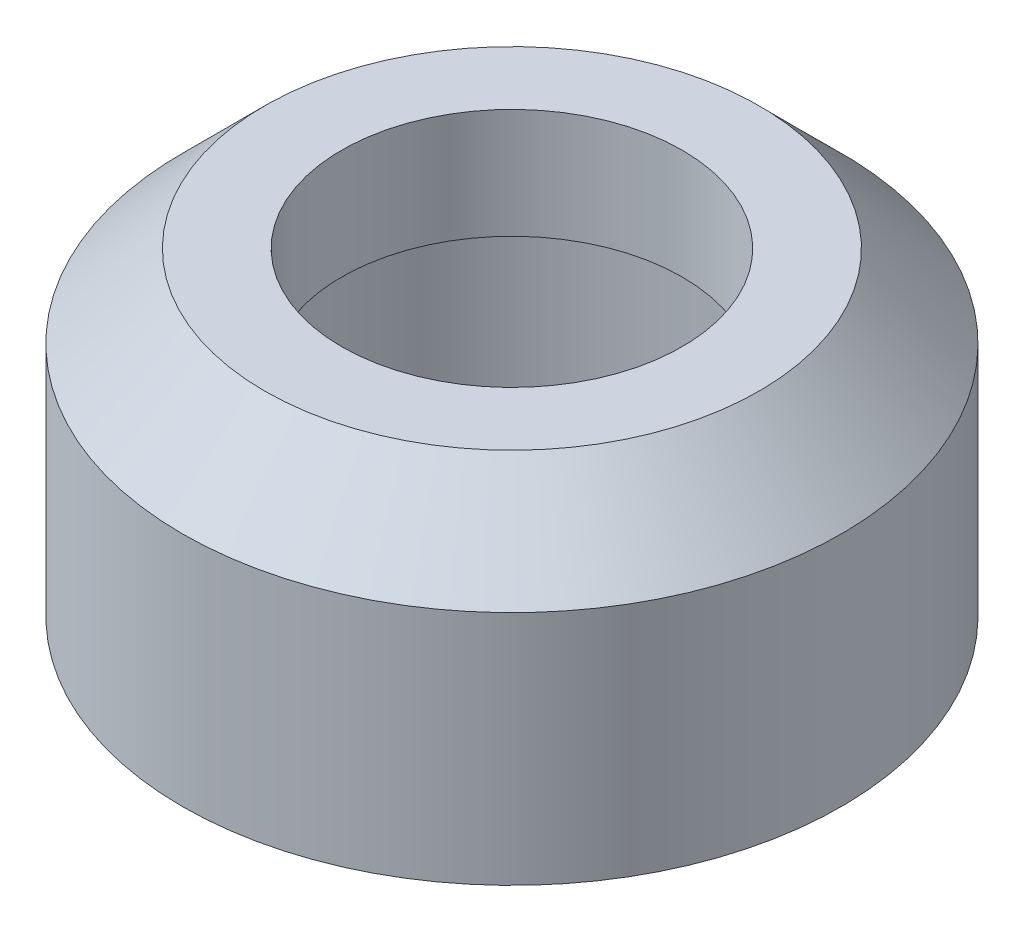
ISO-10303-21;
HEADER;
FILE_DESCRIPTION(('STEP AP214'),'2;1');
FILE_NAME('part.step','',(''),(''),'','','');
FILE_SCHEMA(('AUTOMOTIVE_DESIGN { 1 0 10303 214 1 1 1 1 }'));
ENDSEC;
DATA;
#1=APPLICATION_CONTEXT('core data for automotive mechanical design processes');
#2=APPLICATION_PROTOCOL_DEFINITION('international standard','automotive_design',2000,#1);
#3=PRODUCT_CONTEXT('',#1,'mechanical');
#4=PRODUCT('Part','Part','',(#3));
#5=PRODUCT_RELATED_PRODUCT_CATEGORY('part','',(#4));
#6=PRODUCT_DEFINITION_FORMATION('','',#4);
#7=PRODUCT_DEFINITION_CONTEXT('part definition',#1,'design');
#8=PRODUCT_DEFINITION('design','',#6,#7);
#9=PRODUCT_DEFINITION_SHAPE('','',#8);
#10=(LENGTH_UNIT() NAMED_UNIT(*) SI_UNIT(.MILLI.,.METRE.));
#11=(NAMED_UNIT(*) PLANE_ANGLE_UNIT() SI_UNIT($,.RADIAN.));
#12=(NAMED_UNIT(*) SI_UNIT($,.STERADIAN.) SOLID_ANGLE_UNIT());
#13=UNCERTAINTY_MEASURE_WITH_UNIT(LENGTH_MEASURE(1.E-05),#10,'distance_accuracy_value','');
#14=(GEOMETRIC_REPRESENTATION_CONTEXT(3) GLOBAL_UNCERTAINTY_ASSIGNED_CONTEXT((#13)) GLOBAL_UNIT_ASSIGNED_CONTEXT((#10,
#11,#12)) REPRESENTATION_CONTEXT('',''));
#15=CARTESIAN_POINT('',(0.,0.,0.));
#16=DIRECTION('',(0.,0.,1.));
#17=DIRECTION('',(1.,0.,0.));
#18=AXIS2_PLACEMENT_3D('',#15,#16,#17);
#19=CARTESIAN_POINT('',(0.,5.8,0.));
#20=DIRECTION('',(0.,-1.,0.));
#21=DIRECTION('',(0.,0.,-1.));
#22=AXIS2_PLACEMENT_3D('',#19,#20,#21);
#23=CYLINDRICAL_SURFACE('',#22,3.1);
#24=CARTESIAN_POINT('',(0.,5.8,0.));
#25=DIRECTION('',(0.,1.,0.));
#26=DIRECTION('',(0.,0.,1.));
#27=AXIS2_PLACEMENT_3D('',#24,#25,#26);
#28=CIRCLE('',#27,3.1);
#29=CARTESIAN_POINT('',(0.,5.8,3.1));
#30=VERTEX_POINT('',#29);
#31=EDGE_CURVE('E63',#30,#30,#28,.T.);
#32=ORIENTED_EDGE('',*,*,#31,.T.);
#33=EDGE_LOOP('',(#32));
#34=FACE_BOUND('',#33,.T.);
#35=CARTESIAN_POINT('',(0.,3.8,0.));
#36=DIRECTION('',(0.,-1.,0.));
#37=DIRECTION('',(0.,0.,-1.));
#38=AXIS2_PLACEMENT_3D('',#35,#36,#37);
#39=CIRCLE('',#38,3.1);
#40=CARTESIAN_POINT('',(0.,3.8,-3.1));
#41=VERTEX_POINT('',#40);
#42=EDGE_CURVE('E66',#41,#41,#39,.T.);
#43=ORIENTED_EDGE('',*,*,#42,.T.);
#44=EDGE_LOOP('',(#43));
#45=FACE_BOUND('',#44,.T.);
#46=ADVANCED_FACE('F44',(#34,#45),#23,.F.);
#47=CARTESIAN_POINT('',(0.,5.8,0.));
#48=DIRECTION('',(0.,1.,0.));
#49=DIRECTION('',(0.,0.,1.));
#50=AXIS2_PLACEMENT_3D('',#47,#48,#49);
#51=PLANE('',#50);
#52=CARTESIAN_POINT('',(0.,5.8,0.));
#53=DIRECTION('',(0.,1.,0.));
#54=DIRECTION('',(0.,0.,1.));
#55=AXIS2_PLACEMENT_3D('',#52,#53,#54);
#56=CIRCLE('',#55,4.5);
#57=CARTESIAN_POINT('',(0.,5.8,4.5));
#58=VERTEX_POINT('',#57);
#59=EDGE_CURVE('E53',#58,#58,#56,.T.);
#60=ORIENTED_EDGE('',*,*,#59,.T.);
#61=EDGE_LOOP('',(#60));
#62=FACE_BOUND('',#61,.T.);
#63=ORIENTED_EDGE('',*,*,#31,.F.);
#64=EDGE_LOOP('',(#63));
#65=FACE_BOUND('',#64,.T.);
#66=ADVANCED_FACE('F94',(#62,#65),#51,.T.);
#67=CARTESIAN_POINT('',(0.,0.,0.));
#68=DIRECTION('',(0.,1.,0.));
#69=DIRECTION('',(0.,0.,1.));
#70=AXIS2_PLACEMENT_3D('',#67,#68,#69);
#71=PLANE('',#70);
#72=CARTESIAN_POINT('',(0.,0.,0.));
#73=DIRECTION('',(0.,-1.,0.));
#74=DIRECTION('',(0.,0.,-1.));
#75=AXIS2_PLACEMENT_3D('',#72,#73,#74);
#76=CIRCLE('',#75,4.1);
#77=CARTESIAN_POINT('',(0.,0.,-4.1));
#78=VERTEX_POINT('',#77);
#79=EDGE_CURVE('E74',#78,#78,#76,.T.);
#80=ORIENTED_EDGE('',*,*,#79,.F.);
#81=EDGE_LOOP('',(#80));
#82=FACE_BOUND('',#81,.T.);
#83=CARTESIAN_POINT('',(0.,0.,0.));
#84=DIRECTION('',(0.,1.,0.));
#85=DIRECTION('',(0.,0.,1.));
#86=AXIS2_PLACEMENT_3D('',#83,#84,#85);
#87=CIRCLE('',#86,6.);
#88=CARTESIAN_POINT('',(0.,0.,6.));
#89=VERTEX_POINT('',#88);
#90=EDGE_CURVE('E58',#89,#89,#87,.T.);
#91=ORIENTED_EDGE('',*,*,#90,.F.);
#92=EDGE_LOOP('',(#91));
#93=FACE_BOUND('',#92,.T.);
#94=ADVANCED_FACE('F91',(#82,#93),#71,.F.);
#95=CARTESIAN_POINT('',(0.,5.8,0.));
#96=DIRECTION('',(0.,-1.,0.));
#97=DIRECTION('',(0.,0.,-1.));
#98=AXIS2_PLACEMENT_3D('',#95,#96,#97);
#99=CYLINDRICAL_SURFACE('',#98,6.);
#100=CARTESIAN_POINT('',(0.,4.29999999999999,0.));
#101=DIRECTION('',(0.,1.,0.));
#102=DIRECTION('',(0.,0.,1.));
#103=AXIS2_PLACEMENT_3D('',#100,#101,#102);
#104=CIRCLE('',#103,6.);
#105=CARTESIAN_POINT('',(0.,4.29999999999999,6.));
#106=VERTEX_POINT('',#105);
#107=EDGE_CURVE('E10',#106,#106,#104,.F.);
#108=ORIENTED_EDGE('',*,*,#107,.T.);
#109=EDGE_LOOP('',(#108));
#110=FACE_BOUND('',#109,.T.);
#111=ORIENTED_EDGE('',*,*,#90,.T.);
#112=EDGE_LOOP('',(#111));
#113=FACE_BOUND('',#112,.T.);
#114=ADVANCED_FACE('F87',(#110,#113),#99,.T.);
#115=CARTESIAN_POINT('',(0.,3.8,0.));
#116=DIRECTION('',(0.,-1.,0.));
#117=DIRECTION('',(0.,0.,-1.));
#118=AXIS2_PLACEMENT_3D('',#115,#116,#117);
#119=CYLINDRICAL_SURFACE('',#118,4.1);
#120=CARTESIAN_POINT('',(0.,3.8,0.));
#121=DIRECTION('',(0.,-1.,0.));
#122=DIRECTION('',(0.,0.,-1.));
#123=AXIS2_PLACEMENT_3D('',#120,#121,#122);
#124=CIRCLE('',#123,4.1);
#125=CARTESIAN_POINT('',(0.,3.8,-4.1));
#126=VERTEX_POINT('',#125);
#127=EDGE_CURVE('E69',#126,#126,#124,.T.);
#128=CARTESIAN_POINT('',(0.,3.8,-4.1));
#129=CARTESIAN_POINT('',(0.,3.76041666666667,-4.1));
#130=CARTESIAN_POINT('',(0.,3.72083333333333,-4.1));
#131=CARTESIAN_POINT('',(0.,3.64166666666667,-4.1));
#132=CARTESIAN_POINT('',(0.,3.60208333333333,-4.1));
#133=CARTESIAN_POINT('',(0.,3.52291666666667,-4.1));
#134=CARTESIAN_POINT('',(0.,3.48333333333333,-4.1));
#135=CARTESIAN_POINT('',(0.,3.40416666666667,-4.1));
#136=CARTESIAN_POINT('',(0.,3.36458333333333,-4.1));
#137=CARTESIAN_POINT('',(0.,3.28541666666667,-4.1));
#138=CARTESIAN_POINT('',(0.,3.24583333333333,-4.1));
#139=CARTESIAN_POINT('',(0.,3.16666666666667,-4.1));
#140=CARTESIAN_POINT('',(0.,3.12708333333333,-4.1));
#141=CARTESIAN_POINT('',(0.,3.04791666666667,-4.1));
#142=CARTESIAN_POINT('',(0.,3.00833333333333,-4.1));
#143=CARTESIAN_POINT('',(0.,2.92916666666667,-4.1));
#144=CARTESIAN_POINT('',(0.,2.88958333333333,-4.1));
#145=CARTESIAN_POINT('',(0.,2.81041666666667,-4.1));
#146=CARTESIAN_POINT('',(0.,2.77083333333333,-4.1));
#147=CARTESIAN_POINT('',(0.,2.69166666666667,-4.1));
#148=CARTESIAN_POINT('',(0.,2.65208333333333,-4.1));
#149=CARTESIAN_POINT('',(0.,2.57291666666667,-4.1));
#150=CARTESIAN_POINT('',(0.,2.53333333333333,-4.1));
#151=CARTESIAN_POINT('',(0.,2.45416666666667,-4.1));
#152=CARTESIAN_POINT('',(0.,2.41458333333333,-4.1));
#153=CARTESIAN_POINT('',(0.,2.33541666666667,-4.1));
#154=CARTESIAN_POINT('',(0.,2.29583333333333,-4.1));
#155=CARTESIAN_POINT('',(0.,2.21666666666667,-4.1));
#156=CARTESIAN_POINT('',(0.,2.17708333333333,-4.1));
#157=CARTESIAN_POINT('',(0.,2.09791666666667,-4.1));
#158=CARTESIAN_POINT('',(0.,2.05833333333333,-4.1));
#159=CARTESIAN_POINT('',(0.,1.97916666666667,-4.1));
#160=CARTESIAN_POINT('',(0.,1.93958333333333,-4.1));
#161=CARTESIAN_POINT('',(0.,1.86041666666667,-4.1));
#162=CARTESIAN_POINT('',(0.,1.82083333333333,-4.1));
#163=CARTESIAN_POINT('',(0.,1.74166666666667,-4.1));
#164=CARTESIAN_POINT('',(0.,1.70208333333333,-4.1));
#165=CARTESIAN_POINT('',(0.,1.62291666666667,-4.1));
#166=CARTESIAN_POINT('',(0.,1.58333333333333,-4.1));
#167=CARTESIAN_POINT('',(0.,1.50416666666667,-4.1));
#168=CARTESIAN_POINT('',(0.,1.46458333333333,-4.1));
#169=CARTESIAN_POINT('',(0.,1.38541666666667,-4.1));
#170=CARTESIAN_POINT('',(0.,1.34583333333333,-4.1));
#171=CARTESIAN_POINT('',(0.,1.26666666666667,-4.1));
#172=CARTESIAN_POINT('',(0.,1.22708333333333,-4.1));
#173=CARTESIAN_POINT('',(0.,1.14791666666667,-4.1));
#174=CARTESIAN_POINT('',(0.,1.10833333333333,-4.1));
#175=CARTESIAN_POINT('',(0.,1.02916666666667,-4.1));
#176=CARTESIAN_POINT('',(0.,0.989583333333334,-4.1));
#177=CARTESIAN_POINT('',(0.,0.910416666666667,-4.1));
#178=CARTESIAN_POINT('',(0.,0.870833333333333,-4.1));
#179=CARTESIAN_POINT('',(0.,0.791666666666667,-4.1));
#180=CARTESIAN_POINT('',(0.,0.752083333333333,-4.1));
#181=CARTESIAN_POINT('',(0.,0.672916666666667,-4.1));
#182=CARTESIAN_POINT('',(0.,0.633333333333333,-4.1));
#183=CARTESIAN_POINT('',(0.,0.554166666666667,-4.1));
#184=CARTESIAN_POINT('',(0.,0.514583333333334,-4.1));
#185=CARTESIAN_POINT('',(0.,0.435416666666667,-4.1));
#186=CARTESIAN_POINT('',(0.,0.395833333333334,-4.1));
#187=CARTESIAN_POINT('',(0.,0.316666666666667,-4.1));
#188=CARTESIAN_POINT('',(0.,0.277083333333333,-4.1));
#189=CARTESIAN_POINT('',(0.,0.197916666666667,-4.1));
#190=CARTESIAN_POINT('',(0.,0.158333333333333,-4.1));
#191=CARTESIAN_POINT('',(0.,0.0791666666666666,-4.1));
#192=CARTESIAN_POINT('',(0.,0.0395833333333333,-4.1));
#193=CARTESIAN_POINT('',(0.,0.,-4.1));
#194=B_SPLINE_CURVE_WITH_KNOTS('',3,(#128,#129,#130,#131,#132,#133,#134,#135,#136,#137,#138,
#139,#140,#141,#142,#143,#144,#145,#146,#147,#148,#149,#150,#151,#152,#153,#154,#155,#156,#157,
#158,#159,#160,#161,#162,#163,#164,#165,#166,#167,#168,#169,#170,#171,#172,#173,#174,#175,#176,
#177,#178,#179,#180,#181,#182,#183,#184,#185,#186,#187,#188,#189,#190,#191,#192,#193),
.UNSPECIFIED.,.F.,.F.,(4,2,2,2,2,2,2,2,2,2,2,2,2,2,2,2,2,2,2,2,2,2,2,2,2,2,2,2,2,2,2,2,4),(0.,
0.11875,0.2375,0.35625,0.475,0.59375,0.7125,0.83125,0.95,1.06875,1.1875,1.30625,1.425,1.54375,
1.6625,1.78125,1.9,2.01875,2.1375,2.25625,2.375,2.49375,2.6125,2.73125,2.85,2.96875,3.0875,
3.20625,3.325,3.44375,3.5625,3.68125,3.8),.UNSPECIFIED.);
#195=EDGE_CURVE('BSEAM84',#126,#78,#194,.T.);
#196=ORIENTED_EDGE('',*,*,#127,.F.);
#197=ORIENTED_EDGE('',*,*,#79,.T.);
#198=ORIENTED_EDGE('',*,*,#195,.T.);
#199=ORIENTED_EDGE('',*,*,#195,.F.);
#200=EDGE_LOOP('',(#196,#198,#197,#199));
#201=FACE_BOUND('',#200,.T.);
#202=ADVANCED_FACE('F84',(#201),#119,.F.);
#203=CARTESIAN_POINT('',(0.,3.8,0.));
#204=DIRECTION('',(0.,-1.,0.));
#205=DIRECTION('',(0.,0.,-1.));
#206=AXIS2_PLACEMENT_3D('',#203,#204,#205);
#207=PLANE('',#206);
#208=ORIENTED_EDGE('',*,*,#42,.F.);
#209=EDGE_LOOP('',(#208));
#210=FACE_BOUND('',#209,.T.);
#211=ORIENTED_EDGE('',*,*,#127,.T.);
#212=EDGE_LOOP('',(#211));
#213=FACE_BOUND('',#212,.T.);
#214=ADVANCED_FACE('F82',(#210,#213),#207,.T.);
#215=CARTESIAN_POINT('',(0.,5.8,0.));
#216=DIRECTION('',(0.,-1.,0.));
#217=DIRECTION('',(0.,0.,-1.));
#218=AXIS2_PLACEMENT_3D('',#215,#216,#217);
#219=CONICAL_SURFACE('',#218,4.5,0.785398163397447);
#220=ORIENTED_EDGE('',*,*,#107,.F.);
#221=EDGE_LOOP('',(#220));
#222=FACE_BOUND('',#221,.T.);
#223=ORIENTED_EDGE('',*,*,#59,.F.);
#224=EDGE_LOOP('',(#223));
#225=FACE_BOUND('',#224,.T.);
#226=ADVANCED_FACE('F47',(#222,#225),#219,.T.);
#227=CLOSED_SHELL('',(#46,#66,#94,#114,#202,#214,#226));
#228=MANIFOLD_SOLID_BREP('B2',#227);
#229=ADVANCED_BREP_SHAPE_REPRESENTATION('',(#18,#228),#14);
#230=SHAPE_DEFINITION_REPRESENTATION(#9,#229);
ENDSEC;
END-ISO-10303-21;
